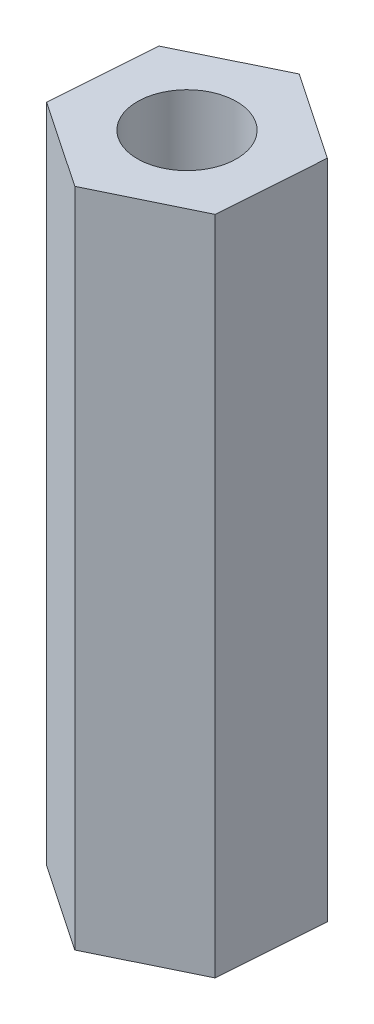
ISO-10303-21;
HEADER;
FILE_DESCRIPTION(('STEP AP214'),'2;1');
FILE_NAME('part.step','',(''),(''),'','','');
FILE_SCHEMA(('AUTOMOTIVE_DESIGN { 1 0 10303 214 1 1 1 1 }'));
ENDSEC;
DATA;
#1=APPLICATION_CONTEXT('core data for automotive mechanical design processes');
#2=APPLICATION_PROTOCOL_DEFINITION('international standard','automotive_design',2000,#1);
#3=PRODUCT_CONTEXT('',#1,'mechanical');
#4=PRODUCT('Part','Part','',(#3));
#5=PRODUCT_RELATED_PRODUCT_CATEGORY('part','',(#4));
#6=PRODUCT_DEFINITION_FORMATION('','',#4);
#7=PRODUCT_DEFINITION_CONTEXT('part definition',#1,'design');
#8=PRODUCT_DEFINITION('design','',#6,#7);
#9=PRODUCT_DEFINITION_SHAPE('','',#8);
#10=(LENGTH_UNIT() NAMED_UNIT(*) SI_UNIT(.MILLI.,.METRE.));
#11=(NAMED_UNIT(*) PLANE_ANGLE_UNIT() SI_UNIT($,.RADIAN.));
#12=(NAMED_UNIT(*) SI_UNIT($,.STERADIAN.) SOLID_ANGLE_UNIT());
#13=UNCERTAINTY_MEASURE_WITH_UNIT(LENGTH_MEASURE(1.E-05),#10,'distance_accuracy_value','');
#14=(GEOMETRIC_REPRESENTATION_CONTEXT(3) GLOBAL_UNCERTAINTY_ASSIGNED_CONTEXT((#13)) GLOBAL_UNIT_ASSIGNED_CONTEXT((#10,
#11,#12)) REPRESENTATION_CONTEXT('',''));
#15=CARTESIAN_POINT('',(0.,0.,0.));
#16=DIRECTION('',(0.,0.,1.));
#17=DIRECTION('',(1.,0.,0.));
#18=AXIS2_PLACEMENT_3D('',#15,#16,#17);
#19=CARTESIAN_POINT('',(0.,20.,0.));
#20=DIRECTION('',(0.,1.,0.));
#21=DIRECTION('',(0.,0.,1.));
#22=AXIS2_PLACEMENT_3D('',#19,#20,#21);
#23=PLANE('',#22);
#24=DIRECTION('',(0.899383491302554,0.,-0.437160537528753));
#25=VECTOR('',#24,1.);
#26=CARTESIAN_POINT('',(-0.225771599018577,20.,3.16739017464063));
#27=LINE('',#26,#25);
#28=CARTESIAN_POINT('',(-0.225771599018577,20.,3.16739017464063));
#29=VERTEX_POINT('',#28);
#30=CARTESIAN_POINT('',(2.63015455542673,20.,1.77921902752344));
#31=VERTEX_POINT('',#30);
#32=EDGE_CURVE('E130',#29,#31,#27,.T.);
#33=ORIENTED_EDGE('',*,*,#32,.T.);
#34=DIRECTION('',(0.0710996146193163,0.,-0.997469219976729));
#35=VECTOR('',#34,1.);
#36=CARTESIAN_POINT('',(2.63015455542673,20.,1.77921902752344));
#37=LINE('',#36,#35);
#38=CARTESIAN_POINT('',(2.8559261544453,20.,-1.3881711471172));
#39=VERTEX_POINT('',#38);
#40=EDGE_CURVE('E88',#31,#39,#37,.T.);
#41=ORIENTED_EDGE('',*,*,#40,.T.);
#42=DIRECTION('',(-0.828283876683238,0.,-0.560308682447976));
#43=VECTOR('',#42,1.);
#44=CARTESIAN_POINT('',(2.8559261544453,20.,-1.3881711471172));
#45=LINE('',#44,#43);
#46=CARTESIAN_POINT('',(0.225771599018577,20.,-3.16739017464063));
#47=VERTEX_POINT('',#46);
#48=EDGE_CURVE('E101',#39,#47,#45,.T.);
#49=ORIENTED_EDGE('',*,*,#48,.T.);
#50=DIRECTION('',(-0.899383491302554,0.,0.437160537528753));
#51=VECTOR('',#50,1.);
#52=CARTESIAN_POINT('',(0.225771599018577,20.,-3.16739017464063));
#53=LINE('',#52,#51);
#54=CARTESIAN_POINT('',(-2.63015455542673,20.,-1.77921902752344));
#55=VERTEX_POINT('',#54);
#56=EDGE_CURVE('E95',#47,#55,#53,.T.);
#57=ORIENTED_EDGE('',*,*,#56,.T.);
#58=DIRECTION('',(-0.0710996146193163,0.,0.997469219976729));
#59=VECTOR('',#58,1.);
#60=CARTESIAN_POINT('',(-2.63015455542673,20.,-1.77921902752344));
#61=LINE('',#60,#59);
#62=CARTESIAN_POINT('',(-2.8559261544453,20.,1.3881711471172));
#63=VERTEX_POINT('',#62);
#64=EDGE_CURVE('E99',#55,#63,#61,.T.);
#65=ORIENTED_EDGE('',*,*,#64,.T.);
#66=DIRECTION('',(0.828283876683238,0.,0.560308682447976));
#67=VECTOR('',#66,1.);
#68=CARTESIAN_POINT('',(-2.8559261544453,20.,1.3881711471172));
#69=LINE('',#68,#67);
#70=EDGE_CURVE('E51',#63,#29,#69,.T.);
#71=ORIENTED_EDGE('',*,*,#70,.T.);
#72=EDGE_LOOP('',(#33,#41,#49,#57,#65,#71));
#73=FACE_BOUND('',#72,.T.);
#74=CARTESIAN_POINT('',(0.,20.,0.));
#75=DIRECTION('',(0.,1.,0.));
#76=DIRECTION('',(0.,0.,1.));
#77=AXIS2_PLACEMENT_3D('',#74,#75,#76);
#78=CIRCLE('',#77,1.5);
#79=CARTESIAN_POINT('',(0.,20.,1.5));
#80=VERTEX_POINT('',#79);
#81=EDGE_CURVE('E123',#80,#80,#78,.T.);
#82=ORIENTED_EDGE('',*,*,#81,.F.);
#83=EDGE_LOOP('',(#82));
#84=FACE_BOUND('',#83,.T.);
#85=ADVANCED_FACE('F34',(#73,#84),#23,.T.);
#86=CARTESIAN_POINT('',(0.,0.,0.));
#87=DIRECTION('',(0.,1.,0.));
#88=DIRECTION('',(0.,0.,1.));
#89=AXIS2_PLACEMENT_3D('',#86,#87,#88);
#90=PLANE('',#89);
#91=DIRECTION('',(0.899383491302554,0.,-0.437160537528753));
#92=VECTOR('',#91,1.);
#93=CARTESIAN_POINT('',(-0.225771599018577,0.,3.16739017464063));
#94=LINE('',#93,#92);
#95=CARTESIAN_POINT('',(-0.225771599018577,0.,3.16739017464063));
#96=VERTEX_POINT('',#95);
#97=CARTESIAN_POINT('',(2.63015455542673,0.,1.77921902752344));
#98=VERTEX_POINT('',#97);
#99=EDGE_CURVE('E119',#96,#98,#94,.T.);
#100=ORIENTED_EDGE('',*,*,#99,.F.);
#101=DIRECTION('',(0.828283876683238,0.,0.560308682447976));
#102=VECTOR('',#101,1.);
#103=CARTESIAN_POINT('',(-2.8559261544453,0.,1.3881711471172));
#104=LINE('',#103,#102);
#105=CARTESIAN_POINT('',(-2.8559261544453,0.,1.3881711471172));
#106=VERTEX_POINT('',#105);
#107=EDGE_CURVE('E80',#106,#96,#104,.T.);
#108=ORIENTED_EDGE('',*,*,#107,.F.);
#109=DIRECTION('',(-0.0710996146193163,0.,0.997469219976729));
#110=VECTOR('',#109,1.);
#111=CARTESIAN_POINT('',(-2.63015455542673,0.,-1.77921902752344));
#112=LINE('',#111,#110);
#113=CARTESIAN_POINT('',(-2.63015455542673,0.,-1.77921902752344));
#114=VERTEX_POINT('',#113);
#115=EDGE_CURVE('E74',#114,#106,#112,.T.);
#116=ORIENTED_EDGE('',*,*,#115,.F.);
#117=DIRECTION('',(-0.899383491302554,0.,0.437160537528753));
#118=VECTOR('',#117,1.);
#119=CARTESIAN_POINT('',(0.225771599018577,0.,-3.16739017464063));
#120=LINE('',#119,#118);
#121=CARTESIAN_POINT('',(0.225771599018577,0.,-3.16739017464063));
#122=VERTEX_POINT('',#121);
#123=EDGE_CURVE('E109',#122,#114,#120,.T.);
#124=ORIENTED_EDGE('',*,*,#123,.F.);
#125=DIRECTION('',(-0.828283876683238,0.,-0.560308682447976));
#126=VECTOR('',#125,1.);
#127=CARTESIAN_POINT('',(2.8559261544453,0.,-1.3881711471172));
#128=LINE('',#127,#126);
#129=CARTESIAN_POINT('',(2.8559261544453,0.,-1.3881711471172));
#130=VERTEX_POINT('',#129);
#131=EDGE_CURVE('E125',#130,#122,#128,.T.);
#132=ORIENTED_EDGE('',*,*,#131,.F.);
#133=DIRECTION('',(0.0710996146193163,0.,-0.997469219976729));
#134=VECTOR('',#133,1.);
#135=CARTESIAN_POINT('',(2.63015455542673,0.,1.77921902752344));
#136=LINE('',#135,#134);
#137=EDGE_CURVE('E122',#98,#130,#136,.T.);
#138=ORIENTED_EDGE('',*,*,#137,.F.);
#139=EDGE_LOOP('',(#100,#108,#116,#124,#132,#138));
#140=FACE_BOUND('',#139,.T.);
#141=CARTESIAN_POINT('',(0.,0.,0.));
#142=DIRECTION('',(0.,1.,0.));
#143=DIRECTION('',(0.,0.,1.));
#144=AXIS2_PLACEMENT_3D('',#141,#142,#143);
#145=CIRCLE('',#144,1.5);
#146=CARTESIAN_POINT('',(0.,0.,1.5));
#147=VERTEX_POINT('',#146);
#148=EDGE_CURVE('E223',#147,#147,#145,.T.);
#149=ORIENTED_EDGE('',*,*,#148,.T.);
#150=EDGE_LOOP('',(#149));
#151=FACE_BOUND('',#150,.T.);
#152=ADVANCED_FACE('F139',(#140,#151),#90,.F.);
#153=CARTESIAN_POINT('',(-0.225771599018577,20.,3.16739017464063));
#154=DIRECTION('',(-0.437160537528753,0.,-0.899383491302554));
#155=DIRECTION('',(-0.899383491302554,0.,0.437160537528753));
#156=AXIS2_PLACEMENT_3D('',#153,#154,#155);
#157=PLANE('',#156);
#158=ORIENTED_EDGE('',*,*,#99,.T.);
#159=DIRECTION('',(0.,-1.,0.));
#160=VECTOR('',#159,1.);
#161=CARTESIAN_POINT('',(2.63015455542673,20.,1.77921902752344));
#162=LINE('',#161,#160);
#163=EDGE_CURVE('E11',#31,#98,#162,.T.);
#164=ORIENTED_EDGE('',*,*,#163,.F.);
#165=ORIENTED_EDGE('',*,*,#32,.F.);
#166=DIRECTION('',(0.,-1.,0.));
#167=VECTOR('',#166,1.);
#168=CARTESIAN_POINT('',(-0.225771599018577,20.,3.16739017464063));
#169=LINE('',#168,#167);
#170=EDGE_CURVE('E115',#29,#96,#169,.T.);
#171=ORIENTED_EDGE('',*,*,#170,.T.);
#172=EDGE_LOOP('',(#158,#164,#165,#171));
#173=FACE_BOUND('',#172,.T.);
#174=ADVANCED_FACE('F36',(#173),#157,.F.);
#175=CARTESIAN_POINT('',(2.63015455542673,20.,1.77921902752344));
#176=DIRECTION('',(-0.997469219976729,0.,-0.0710996146193163));
#177=DIRECTION('',(-0.0710996146193163,0.,0.997469219976729));
#178=AXIS2_PLACEMENT_3D('',#175,#176,#177);
#179=PLANE('',#178);
#180=ORIENTED_EDGE('',*,*,#137,.T.);
#181=DIRECTION('',(0.,-1.,0.));
#182=VECTOR('',#181,1.);
#183=CARTESIAN_POINT('',(2.8559261544453,20.,-1.3881711471172));
#184=LINE('',#183,#182);
#185=EDGE_CURVE('E43',#39,#130,#184,.T.);
#186=ORIENTED_EDGE('',*,*,#185,.F.);
#187=ORIENTED_EDGE('',*,*,#40,.F.);
#188=ORIENTED_EDGE('',*,*,#163,.T.);
#189=EDGE_LOOP('',(#180,#186,#187,#188));
#190=FACE_BOUND('',#189,.T.);
#191=ADVANCED_FACE('F164',(#190),#179,.F.);
#192=CARTESIAN_POINT('',(2.8559261544453,20.,-1.3881711471172));
#193=DIRECTION('',(-0.560308682447976,0.,0.828283876683238));
#194=DIRECTION('',(0.828283876683238,0.,0.560308682447976));
#195=AXIS2_PLACEMENT_3D('',#192,#193,#194);
#196=PLANE('',#195);
#197=ORIENTED_EDGE('',*,*,#131,.T.);
#198=DIRECTION('',(0.,-1.,0.));
#199=VECTOR('',#198,1.);
#200=CARTESIAN_POINT('',(0.225771599018577,20.,-3.16739017464063));
#201=LINE('',#200,#199);
#202=EDGE_CURVE('E110',#47,#122,#201,.T.);
#203=ORIENTED_EDGE('',*,*,#202,.F.);
#204=ORIENTED_EDGE('',*,*,#48,.F.);
#205=ORIENTED_EDGE('',*,*,#185,.T.);
#206=EDGE_LOOP('',(#197,#203,#204,#205));
#207=FACE_BOUND('',#206,.T.);
#208=ADVANCED_FACE('F136',(#207),#196,.F.);
#209=CARTESIAN_POINT('',(0.225771599018577,20.,-3.16739017464063));
#210=DIRECTION('',(0.437160537528753,0.,0.899383491302554));
#211=DIRECTION('',(0.899383491302554,0.,-0.437160537528753));
#212=AXIS2_PLACEMENT_3D('',#209,#210,#211);
#213=PLANE('',#212);
#214=ORIENTED_EDGE('',*,*,#123,.T.);
#215=DIRECTION('',(0.,-1.,0.));
#216=VECTOR('',#215,1.);
#217=CARTESIAN_POINT('',(-2.63015455542673,20.,-1.77921902752344));
#218=LINE('',#217,#216);
#219=EDGE_CURVE('E106',#55,#114,#218,.T.);
#220=ORIENTED_EDGE('',*,*,#219,.F.);
#221=ORIENTED_EDGE('',*,*,#56,.F.);
#222=ORIENTED_EDGE('',*,*,#202,.T.);
#223=EDGE_LOOP('',(#214,#220,#221,#222));
#224=FACE_BOUND('',#223,.T.);
#225=ADVANCED_FACE('F107',(#224),#213,.F.);
#226=CARTESIAN_POINT('',(-2.63015455542673,20.,-1.77921902752344));
#227=DIRECTION('',(0.997469219976729,0.,0.0710996146193163));
#228=DIRECTION('',(0.0710996146193163,0.,-0.997469219976729));
#229=AXIS2_PLACEMENT_3D('',#226,#227,#228);
#230=PLANE('',#229);
#231=ORIENTED_EDGE('',*,*,#115,.T.);
#232=DIRECTION('',(0.,-1.,0.));
#233=VECTOR('',#232,1.);
#234=CARTESIAN_POINT('',(-2.8559261544453,20.,1.3881711471172));
#235=LINE('',#234,#233);
#236=EDGE_CURVE('E111',#63,#106,#235,.T.);
#237=ORIENTED_EDGE('',*,*,#236,.F.);
#238=ORIENTED_EDGE('',*,*,#64,.F.);
#239=ORIENTED_EDGE('',*,*,#219,.T.);
#240=EDGE_LOOP('',(#231,#237,#238,#239));
#241=FACE_BOUND('',#240,.T.);
#242=ADVANCED_FACE('F113',(#241),#230,.F.);
#243=CARTESIAN_POINT('',(-2.8559261544453,20.,1.3881711471172));
#244=DIRECTION('',(0.560308682447976,0.,-0.828283876683238));
#245=DIRECTION('',(-0.828283876683238,0.,-0.560308682447976));
#246=AXIS2_PLACEMENT_3D('',#243,#244,#245);
#247=PLANE('',#246);
#248=ORIENTED_EDGE('',*,*,#107,.T.);
#249=ORIENTED_EDGE('',*,*,#170,.F.);
#250=ORIENTED_EDGE('',*,*,#70,.F.);
#251=ORIENTED_EDGE('',*,*,#236,.T.);
#252=EDGE_LOOP('',(#248,#249,#250,#251));
#253=FACE_BOUND('',#252,.T.);
#254=ADVANCED_FACE('F144',(#253),#247,.F.);
#255=CARTESIAN_POINT('',(0.,20.,0.));
#256=DIRECTION('',(0.,-1.,0.));
#257=DIRECTION('',(0.,0.,-1.));
#258=AXIS2_PLACEMENT_3D('',#255,#256,#257);
#259=CYLINDRICAL_SURFACE('',#258,1.5);
#260=ORIENTED_EDGE('',*,*,#81,.T.);
#261=EDGE_LOOP('',(#260));
#262=FACE_BOUND('',#261,.T.);
#263=ORIENTED_EDGE('',*,*,#148,.F.);
#264=EDGE_LOOP('',(#263));
#265=FACE_BOUND('',#264,.T.);
#266=ADVANCED_FACE('F146',(#262,#265),#259,.F.);
#267=CLOSED_SHELL('',(#85,#152,#174,#191,#208,#225,#242,#254,#266));
#268=MANIFOLD_SOLID_BREP('B2',#267);
#269=ADVANCED_BREP_SHAPE_REPRESENTATION('',(#18,#268),#14);
#270=SHAPE_DEFINITION_REPRESENTATION(#9,#269);
ENDSEC;
END-ISO-10303-21;
